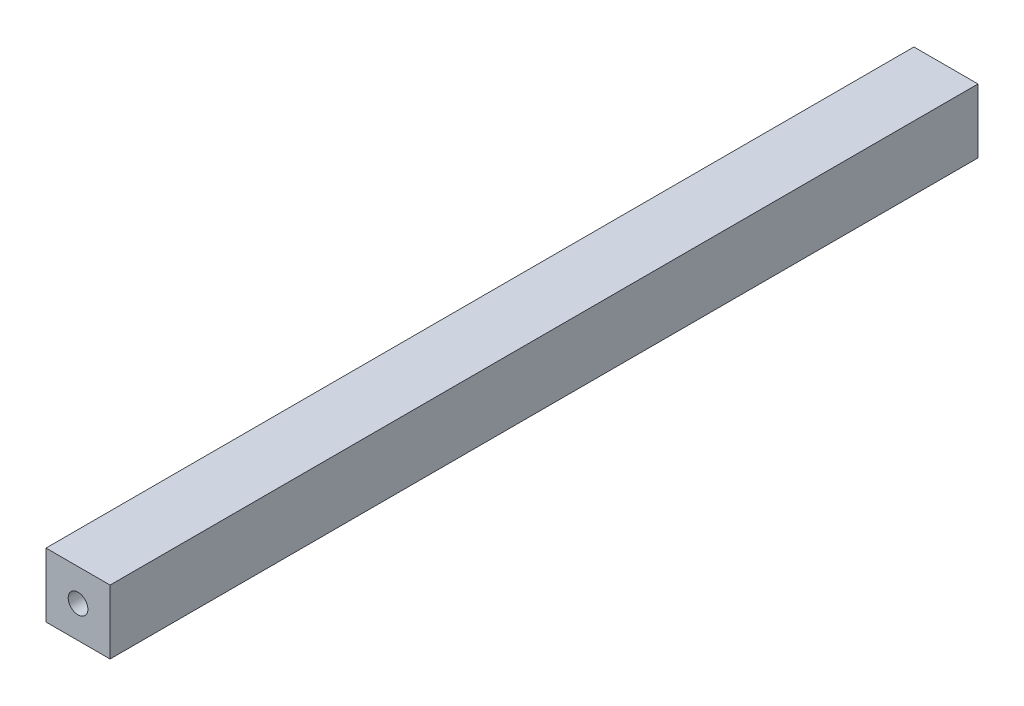
ISO-10303-21;
HEADER;
FILE_DESCRIPTION(('STEP AP214'),'2;1');
FILE_NAME('part.step','',(''),(''),'','','');
FILE_SCHEMA(('AUTOMOTIVE_DESIGN { 1 0 10303 214 1 1 1 1 }'));
ENDSEC;
DATA;
#1=APPLICATION_CONTEXT('core data for automotive mechanical design processes');
#2=APPLICATION_PROTOCOL_DEFINITION('international standard','automotive_design',2000,#1);
#3=PRODUCT_CONTEXT('',#1,'mechanical');
#4=PRODUCT('Part','Part','',(#3));
#5=PRODUCT_RELATED_PRODUCT_CATEGORY('part','',(#4));
#6=PRODUCT_DEFINITION_FORMATION('','',#4);
#7=PRODUCT_DEFINITION_CONTEXT('part definition',#1,'design');
#8=PRODUCT_DEFINITION('design','',#6,#7);
#9=PRODUCT_DEFINITION_SHAPE('','',#8);
#10=(LENGTH_UNIT() NAMED_UNIT(*) SI_UNIT(.MILLI.,.METRE.));
#11=(NAMED_UNIT(*) PLANE_ANGLE_UNIT() SI_UNIT($,.RADIAN.));
#12=(NAMED_UNIT(*) SI_UNIT($,.STERADIAN.) SOLID_ANGLE_UNIT());
#13=UNCERTAINTY_MEASURE_WITH_UNIT(LENGTH_MEASURE(1.E-05),#10,'distance_accuracy_value','');
#14=(GEOMETRIC_REPRESENTATION_CONTEXT(3) GLOBAL_UNCERTAINTY_ASSIGNED_CONTEXT((#13)) GLOBAL_UNIT_ASSIGNED_CONTEXT((#10,
#11,#12)) REPRESENTATION_CONTEXT('',''));
#15=CARTESIAN_POINT('',(0.,0.,0.));
#16=DIRECTION('',(0.,0.,1.));
#17=DIRECTION('',(1.,0.,0.));
#18=AXIS2_PLACEMENT_3D('',#15,#16,#17);
#19=CARTESIAN_POINT('',(0.,0.,298.));
#20=DIRECTION('',(1.,0.,0.));
#21=DIRECTION('',(0.,0.,-1.));
#22=AXIS2_PLACEMENT_3D('',#19,#20,#21);
#23=PLANE('',#22);
#24=DIRECTION('',(0.,-1.,0.));
#25=VECTOR('',#24,1.);
#26=CARTESIAN_POINT('',(0.,0.,0.));
#27=LINE('',#26,#25);
#28=CARTESIAN_POINT('',(0.,22.,0.));
#29=VERTEX_POINT('',#28);
#30=CARTESIAN_POINT('',(0.,0.,0.));
#31=VERTEX_POINT('',#30);
#32=EDGE_CURVE('E77',#29,#31,#27,.T.);
#33=ORIENTED_EDGE('',*,*,#32,.T.);
#34=DIRECTION('',(0.,0.,-1.));
#35=VECTOR('',#34,1.);
#36=CARTESIAN_POINT('',(0.,0.,298.));
#37=LINE('',#36,#35);
#38=CARTESIAN_POINT('',(0.,0.,298.));
#39=VERTEX_POINT('',#38);
#40=EDGE_CURVE('E11',#39,#31,#37,.T.);
#41=ORIENTED_EDGE('',*,*,#40,.F.);
#42=DIRECTION('',(0.,-1.,0.));
#43=VECTOR('',#42,1.);
#44=CARTESIAN_POINT('',(0.,0.,298.));
#45=LINE('',#44,#43);
#46=CARTESIAN_POINT('',(0.,22.,298.));
#47=VERTEX_POINT('',#46);
#48=EDGE_CURVE('E100',#47,#39,#45,.T.);
#49=ORIENTED_EDGE('',*,*,#48,.F.);
#50=DIRECTION('',(0.,0.,-1.));
#51=VECTOR('',#50,1.);
#52=CARTESIAN_POINT('',(0.,22.,298.));
#53=LINE('',#52,#51);
#54=EDGE_CURVE('E89',#47,#29,#53,.T.);
#55=ORIENTED_EDGE('',*,*,#54,.T.);
#56=EDGE_LOOP('',(#33,#41,#49,#55));
#57=FACE_BOUND('',#56,.T.);
#58=ADVANCED_FACE('F33',(#57),#23,.F.);
#59=CARTESIAN_POINT('',(0.,0.,298.));
#60=DIRECTION('',(0.,1.,0.));
#61=DIRECTION('',(0.,0.,1.));
#62=AXIS2_PLACEMENT_3D('',#59,#60,#61);
#63=PLANE('',#62);
#64=DIRECTION('',(1.,0.,0.));
#65=VECTOR('',#64,1.);
#66=CARTESIAN_POINT('',(0.,0.,0.));
#67=LINE('',#66,#65);
#68=CARTESIAN_POINT('',(22.,0.,0.));
#69=VERTEX_POINT('',#68);
#70=EDGE_CURVE('E73',#31,#69,#67,.T.);
#71=ORIENTED_EDGE('',*,*,#70,.T.);
#72=DIRECTION('',(0.,0.,-1.));
#73=VECTOR('',#72,1.);
#74=CARTESIAN_POINT('',(22.,0.,298.));
#75=LINE('',#74,#73);
#76=CARTESIAN_POINT('',(22.,0.,298.));
#77=VERTEX_POINT('',#76);
#78=EDGE_CURVE('E40',#77,#69,#75,.T.);
#79=ORIENTED_EDGE('',*,*,#78,.F.);
#80=DIRECTION('',(1.,0.,0.));
#81=VECTOR('',#80,1.);
#82=CARTESIAN_POINT('',(0.,0.,298.));
#83=LINE('',#82,#81);
#84=EDGE_CURVE('E85',#39,#77,#83,.T.);
#85=ORIENTED_EDGE('',*,*,#84,.F.);
#86=ORIENTED_EDGE('',*,*,#40,.T.);
#87=EDGE_LOOP('',(#71,#79,#85,#86));
#88=FACE_BOUND('',#87,.T.);
#89=ADVANCED_FACE('F84',(#88),#63,.F.);
#90=CARTESIAN_POINT('',(22.,0.,298.));
#91=DIRECTION('',(-1.,0.,0.));
#92=DIRECTION('',(0.,0.,1.));
#93=AXIS2_PLACEMENT_3D('',#90,#91,#92);
#94=PLANE('',#93);
#95=DIRECTION('',(0.,1.,0.));
#96=VECTOR('',#95,1.);
#97=CARTESIAN_POINT('',(22.,0.,0.));
#98=LINE('',#97,#96);
#99=CARTESIAN_POINT('',(22.,22.,0.));
#100=VERTEX_POINT('',#99);
#101=EDGE_CURVE('E78',#69,#100,#98,.T.);
#102=ORIENTED_EDGE('',*,*,#101,.T.);
#103=DIRECTION('',(0.,0.,-1.));
#104=VECTOR('',#103,1.);
#105=CARTESIAN_POINT('',(22.,22.,298.));
#106=LINE('',#105,#104);
#107=CARTESIAN_POINT('',(22.,22.,298.));
#108=VERTEX_POINT('',#107);
#109=EDGE_CURVE('E106',#108,#100,#106,.T.);
#110=ORIENTED_EDGE('',*,*,#109,.F.);
#111=DIRECTION('',(0.,1.,0.));
#112=VECTOR('',#111,1.);
#113=CARTESIAN_POINT('',(22.,0.,298.));
#114=LINE('',#113,#112);
#115=EDGE_CURVE('E52',#77,#108,#114,.T.);
#116=ORIENTED_EDGE('',*,*,#115,.F.);
#117=ORIENTED_EDGE('',*,*,#78,.T.);
#118=EDGE_LOOP('',(#102,#110,#116,#117));
#119=FACE_BOUND('',#118,.T.);
#120=ADVANCED_FACE('F109',(#119),#94,.F.);
#121=CARTESIAN_POINT('',(0.,22.,298.));
#122=DIRECTION('',(0.,-1.,0.));
#123=DIRECTION('',(0.,0.,-1.));
#124=AXIS2_PLACEMENT_3D('',#121,#122,#123);
#125=PLANE('',#124);
#126=DIRECTION('',(-1.,0.,0.));
#127=VECTOR('',#126,1.);
#128=CARTESIAN_POINT('',(0.,22.,0.));
#129=LINE('',#128,#127);
#130=EDGE_CURVE('E98',#100,#29,#129,.T.);
#131=ORIENTED_EDGE('',*,*,#130,.T.);
#132=ORIENTED_EDGE('',*,*,#54,.F.);
#133=DIRECTION('',(-1.,0.,0.));
#134=VECTOR('',#133,1.);
#135=CARTESIAN_POINT('',(0.,22.,298.));
#136=LINE('',#135,#134);
#137=EDGE_CURVE('E47',#108,#47,#136,.T.);
#138=ORIENTED_EDGE('',*,*,#137,.F.);
#139=ORIENTED_EDGE('',*,*,#109,.T.);
#140=EDGE_LOOP('',(#131,#132,#138,#139));
#141=FACE_BOUND('',#140,.T.);
#142=ADVANCED_FACE('F111',(#141),#125,.F.);
#143=CARTESIAN_POINT('',(0.,22.,298.));
#144=DIRECTION('',(0.,0.,-1.));
#145=DIRECTION('',(-1.,0.,0.));
#146=AXIS2_PLACEMENT_3D('',#143,#144,#145);
#147=PLANE('',#146);
#148=CARTESIAN_POINT('',(11.,11.,298.));
#149=DIRECTION('',(0.,0.,1.));
#150=DIRECTION('',(1.,0.,0.));
#151=AXIS2_PLACEMENT_3D('',#148,#149,#150);
#152=CIRCLE('',#151,3.375);
#153=CARTESIAN_POINT('',(14.375,11.,298.));
#154=VERTEX_POINT('',#153);
#155=EDGE_CURVE('E93',#154,#154,#152,.T.);
#156=ORIENTED_EDGE('',*,*,#155,.F.);
#157=EDGE_LOOP('',(#156));
#158=FACE_BOUND('',#157,.T.);
#159=ORIENTED_EDGE('',*,*,#48,.T.);
#160=ORIENTED_EDGE('',*,*,#84,.T.);
#161=ORIENTED_EDGE('',*,*,#115,.T.);
#162=ORIENTED_EDGE('',*,*,#137,.T.);
#163=EDGE_LOOP('',(#159,#160,#161,#162));
#164=FACE_BOUND('',#163,.T.);
#165=ADVANCED_FACE('F112',(#158,#164),#147,.F.);
#166=CARTESIAN_POINT('',(0.,22.,0.));
#167=DIRECTION('',(0.,0.,-1.));
#168=DIRECTION('',(-1.,0.,0.));
#169=AXIS2_PLACEMENT_3D('',#166,#167,#168);
#170=PLANE('',#169);
#171=CARTESIAN_POINT('',(11.,11.,0.));
#172=DIRECTION('',(0.,0.,-1.));
#173=DIRECTION('',(-1.,0.,0.));
#174=AXIS2_PLACEMENT_3D('',#171,#172,#173);
#175=CIRCLE('',#174,3.375);
#176=CARTESIAN_POINT('',(7.625,11.,0.));
#177=VERTEX_POINT('',#176);
#178=EDGE_CURVE('E195',#177,#177,#175,.T.);
#179=ORIENTED_EDGE('',*,*,#178,.F.);
#180=EDGE_LOOP('',(#179));
#181=FACE_BOUND('',#180,.T.);
#182=ORIENTED_EDGE('',*,*,#32,.F.);
#183=ORIENTED_EDGE('',*,*,#130,.F.);
#184=ORIENTED_EDGE('',*,*,#101,.F.);
#185=ORIENTED_EDGE('',*,*,#70,.F.);
#186=EDGE_LOOP('',(#182,#183,#184,#185));
#187=FACE_BOUND('',#186,.T.);
#188=ADVANCED_FACE('F74',(#181,#187),#170,.T.);
#189=CARTESIAN_POINT('',(11.,11.,273.));
#190=DIRECTION('',(0.,0.,1.));
#191=DIRECTION('',(1.,0.,0.));
#192=AXIS2_PLACEMENT_3D('',#189,#190,#191);
#193=CYLINDRICAL_SURFACE('',#192,3.375);
#194=CARTESIAN_POINT('',(11.,11.,273.));
#195=DIRECTION('',(0.,0.,1.));
#196=DIRECTION('',(1.,0.,0.));
#197=AXIS2_PLACEMENT_3D('',#194,#195,#196);
#198=CIRCLE('',#197,3.375);
#199=CARTESIAN_POINT('',(14.375,11.,273.));
#200=VERTEX_POINT('',#199);
#201=EDGE_CURVE('E90',#200,#200,#198,.T.);
#202=ORIENTED_EDGE('',*,*,#201,.F.);
#203=EDGE_LOOP('',(#202));
#204=FACE_BOUND('',#203,.T.);
#205=ORIENTED_EDGE('',*,*,#155,.T.);
#206=EDGE_LOOP('',(#205));
#207=FACE_BOUND('',#206,.T.);
#208=ADVANCED_FACE('F120',(#204,#207),#193,.F.);
#209=CARTESIAN_POINT('',(11.,11.,273.));
#210=DIRECTION('',(0.,0.,1.));
#211=DIRECTION('',(1.,0.,0.));
#212=AXIS2_PLACEMENT_3D('',#209,#210,#211);
#213=PLANE('',#212);
#214=ORIENTED_EDGE('',*,*,#201,.T.);
#215=EDGE_LOOP('',(#214));
#216=FACE_BOUND('',#215,.T.);
#217=ADVANCED_FACE('F158',(#216),#213,.T.);
#218=CARTESIAN_POINT('',(11.,11.,25.));
#219=DIRECTION('',(0.,0.,-1.));
#220=DIRECTION('',(-1.,0.,0.));
#221=AXIS2_PLACEMENT_3D('',#218,#219,#220);
#222=CYLINDRICAL_SURFACE('',#221,3.375);
#223=CARTESIAN_POINT('',(11.,11.,25.));
#224=DIRECTION('',(0.,0.,-1.));
#225=DIRECTION('',(-1.,0.,0.));
#226=AXIS2_PLACEMENT_3D('',#223,#224,#225);
#227=CIRCLE('',#226,3.375);
#228=CARTESIAN_POINT('',(7.625,11.,25.));
#229=VERTEX_POINT('',#228);
#230=EDGE_CURVE('E194',#229,#229,#227,.T.);
#231=ORIENTED_EDGE('',*,*,#230,.F.);
#232=EDGE_LOOP('',(#231));
#233=FACE_BOUND('',#232,.T.);
#234=ORIENTED_EDGE('',*,*,#178,.T.);
#235=EDGE_LOOP('',(#234));
#236=FACE_BOUND('',#235,.T.);
#237=ADVANCED_FACE('F168',(#233,#236),#222,.F.);
#238=CARTESIAN_POINT('',(11.,11.,25.));
#239=DIRECTION('',(0.,0.,-1.));
#240=DIRECTION('',(-1.,0.,0.));
#241=AXIS2_PLACEMENT_3D('',#238,#239,#240);
#242=PLANE('',#241);
#243=ORIENTED_EDGE('',*,*,#230,.T.);
#244=EDGE_LOOP('',(#243));
#245=FACE_BOUND('',#244,.T.);
#246=ADVANCED_FACE('F178',(#245),#242,.T.);
#247=CLOSED_SHELL('',(#58,#89,#120,#142,#165,#188,#208,#217,#237,#246));
#248=MANIFOLD_SOLID_BREP('B2',#247);
#249=ADVANCED_BREP_SHAPE_REPRESENTATION('',(#18,#248),#14);
#250=SHAPE_DEFINITION_REPRESENTATION(#9,#249);
ENDSEC;
END-ISO-10303-21;
